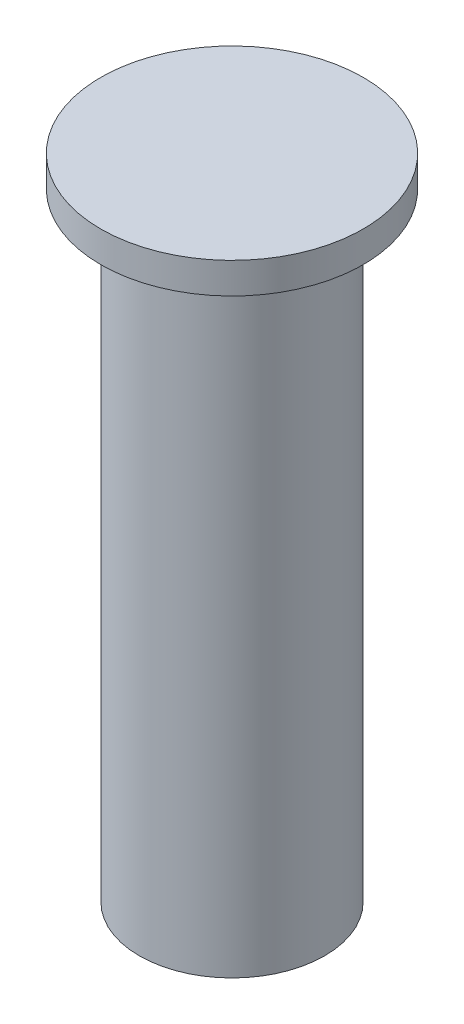
ISO-10303-21;
HEADER;
FILE_DESCRIPTION(('STEP AP214'),'2;1');
FILE_NAME('part.step','',(''),(''),'','','');
FILE_SCHEMA(('AUTOMOTIVE_DESIGN { 1 0 10303 214 1 1 1 1 }'));
ENDSEC;
DATA;
#1=APPLICATION_CONTEXT('core data for automotive mechanical design processes');
#2=APPLICATION_PROTOCOL_DEFINITION('international standard','automotive_design',2000,#1);
#3=PRODUCT_CONTEXT('',#1,'mechanical');
#4=PRODUCT('Part','Part','',(#3));
#5=PRODUCT_RELATED_PRODUCT_CATEGORY('part','',(#4));
#6=PRODUCT_DEFINITION_FORMATION('','',#4);
#7=PRODUCT_DEFINITION_CONTEXT('part definition',#1,'design');
#8=PRODUCT_DEFINITION('design','',#6,#7);
#9=PRODUCT_DEFINITION_SHAPE('','',#8);
#10=(LENGTH_UNIT() NAMED_UNIT(*) SI_UNIT(.MILLI.,.METRE.));
#11=(NAMED_UNIT(*) PLANE_ANGLE_UNIT() SI_UNIT($,.RADIAN.));
#12=(NAMED_UNIT(*) SI_UNIT($,.STERADIAN.) SOLID_ANGLE_UNIT());
#13=UNCERTAINTY_MEASURE_WITH_UNIT(LENGTH_MEASURE(1.E-05),#10,'distance_accuracy_value','');
#14=(GEOMETRIC_REPRESENTATION_CONTEXT(3) GLOBAL_UNCERTAINTY_ASSIGNED_CONTEXT((#13)) GLOBAL_UNIT_ASSIGNED_CONTEXT((#10,
#11,#12)) REPRESENTATION_CONTEXT('',''));
#15=CARTESIAN_POINT('',(0.,0.,0.));
#16=DIRECTION('',(0.,0.,1.));
#17=DIRECTION('',(1.,0.,0.));
#18=AXIS2_PLACEMENT_3D('',#15,#16,#17);
#19=CARTESIAN_POINT('',(-56.2916512459885,-125.,0.));
#20=DIRECTION('',(0.,1.,0.));
#21=DIRECTION('',(0.,0.,1.));
#22=AXIS2_PLACEMENT_3D('',#19,#20,#21);
#23=CYLINDRICAL_SURFACE('',#22,8.50000000000001);
#24=CARTESIAN_POINT('',(-56.2916512459885,-125.,0.));
#25=DIRECTION('',(0.,-1.,0.));
#26=DIRECTION('',(0.,0.,-1.));
#27=AXIS2_PLACEMENT_3D('',#24,#25,#26);
#28=CIRCLE('',#27,8.50000000000001);
#29=CARTESIAN_POINT('',(-56.2916512459885,-125.,-8.50000000000002));
#30=VERTEX_POINT('',#29);
#31=EDGE_CURVE('E46',#30,#30,#28,.T.);
#32=ORIENTED_EDGE('',*,*,#31,.F.);
#33=EDGE_LOOP('',(#32));
#34=FACE_BOUND('',#33,.T.);
#35=CARTESIAN_POINT('',(-56.2916512459885,-123.,0.));
#36=DIRECTION('',(0.,-1.,0.));
#37=DIRECTION('',(0.,0.,-1.));
#38=AXIS2_PLACEMENT_3D('',#35,#36,#37);
#39=CIRCLE('',#38,8.50000000000001);
#40=CARTESIAN_POINT('',(-56.2916512459885,-123.,-8.50000000000002));
#41=VERTEX_POINT('',#40);
#42=EDGE_CURVE('E45',#41,#41,#39,.T.);
#43=ORIENTED_EDGE('',*,*,#42,.T.);
#44=EDGE_LOOP('',(#43));
#45=FACE_BOUND('',#44,.T.);
#46=ADVANCED_FACE('F39',(#34,#45),#23,.T.);
#47=CARTESIAN_POINT('',(-56.2916512459885,-125.,0.));
#48=DIRECTION('',(0.,-1.,0.));
#49=DIRECTION('',(0.,0.,-1.));
#50=AXIS2_PLACEMENT_3D('',#47,#48,#49);
#51=PLANE('',#50);
#52=CARTESIAN_POINT('',(-56.2916512459887,-125.,-1.28574312865734E-13));
#53=DIRECTION('',(0.,-1.,0.));
#54=DIRECTION('',(0.,0.,-1.));
#55=AXIS2_PLACEMENT_3D('',#52,#53,#54);
#56=CIRCLE('',#55,5.99999999999997);
#57=CARTESIAN_POINT('',(-56.2916512459887,-125.,-6.0000000000001));
#58=VERTEX_POINT('',#57);
#59=EDGE_CURVE('E10',#58,#58,#56,.T.);
#60=ORIENTED_EDGE('',*,*,#59,.F.);
#61=EDGE_LOOP('',(#60));
#62=FACE_BOUND('',#61,.T.);
#63=ORIENTED_EDGE('',*,*,#31,.T.);
#64=EDGE_LOOP('',(#63));
#65=FACE_BOUND('',#64,.T.);
#66=ADVANCED_FACE('F61',(#62,#65),#51,.T.);
#67=CARTESIAN_POINT('',(-56.2916512459885,-123.,0.));
#68=DIRECTION('',(0.,-1.,0.));
#69=DIRECTION('',(0.,0.,-1.));
#70=AXIS2_PLACEMENT_3D('',#67,#68,#69);
#71=PLANE('',#70);
#72=ORIENTED_EDGE('',*,*,#42,.F.);
#73=EDGE_LOOP('',(#72));
#74=FACE_BOUND('',#73,.T.);
#75=ADVANCED_FACE('F58',(#74),#71,.F.);
#76=CARTESIAN_POINT('',(-56.2916512459887,-156.5,-1.28574312865734E-13));
#77=DIRECTION('',(0.,1.,0.));
#78=DIRECTION('',(0.,0.,1.));
#79=AXIS2_PLACEMENT_3D('',#76,#77,#78);
#80=CYLINDRICAL_SURFACE('',#79,5.99999999999997);
#81=ORIENTED_EDGE('',*,*,#59,.T.);
#82=EDGE_LOOP('',(#81));
#83=FACE_BOUND('',#82,.T.);
#84=CARTESIAN_POINT('',(-56.2916512459886,-165.,0.));
#85=DIRECTION('',(0.,-1.,0.));
#86=DIRECTION('',(0.,0.,-1.));
#87=AXIS2_PLACEMENT_3D('',#84,#85,#86);
#88=CIRCLE('',#87,5.99999999999995);
#89=CARTESIAN_POINT('',(-56.2916512459886,-165.,-5.99999999999996));
#90=VERTEX_POINT('',#89);
#91=EDGE_CURVE('E55',#90,#90,#88,.T.);
#92=ORIENTED_EDGE('',*,*,#91,.F.);
#93=EDGE_LOOP('',(#92));
#94=FACE_BOUND('',#93,.T.);
#95=ADVANCED_FACE('F65',(#83,#94),#80,.T.);
#96=CARTESIAN_POINT('',(-56.2916512459886,-165.,0.));
#97=DIRECTION('',(0.,-1.,0.));
#98=DIRECTION('',(0.,0.,-1.));
#99=AXIS2_PLACEMENT_3D('',#96,#97,#98);
#100=PLANE('',#99);
#101=ORIENTED_EDGE('',*,*,#91,.T.);
#102=EDGE_LOOP('',(#101));
#103=FACE_BOUND('',#102,.T.);
#104=ADVANCED_FACE('F67',(#103),#100,.T.);
#105=CLOSED_SHELL('',(#46,#66,#75,#95,#104));
#106=MANIFOLD_SOLID_BREP('B2',#105);
#107=ADVANCED_BREP_SHAPE_REPRESENTATION('',(#18,#106),#14);
#108=SHAPE_DEFINITION_REPRESENTATION(#9,#107);
ENDSEC;
END-ISO-10303-21;
